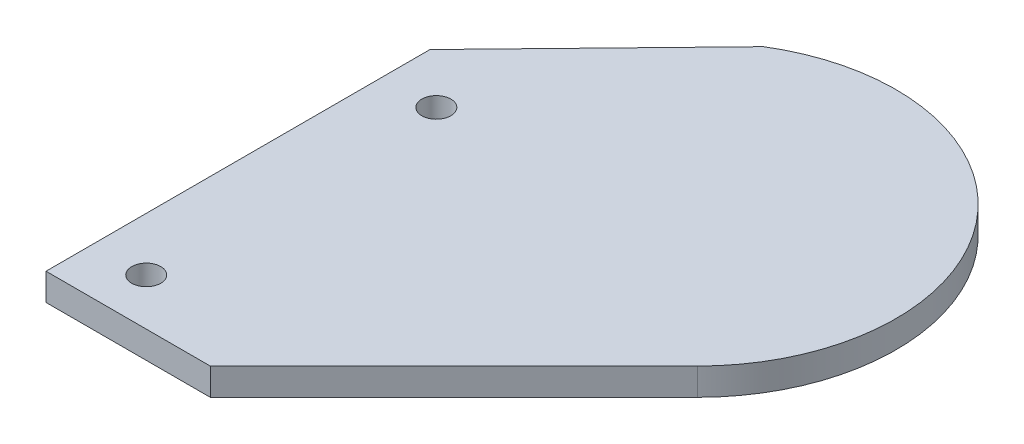
ISO-10303-21;
HEADER;
FILE_DESCRIPTION(('STEP AP214'),'2;1');
FILE_NAME('part.step','',(''),(''),'','','');
FILE_SCHEMA(('AUTOMOTIVE_DESIGN { 1 0 10303 214 1 1 1 1 }'));
ENDSEC;
DATA;
#1=APPLICATION_CONTEXT('core data for automotive mechanical design processes');
#2=APPLICATION_PROTOCOL_DEFINITION('international standard','automotive_design',2000,#1);
#3=PRODUCT_CONTEXT('',#1,'mechanical');
#4=PRODUCT('Part','Part','',(#3));
#5=PRODUCT_RELATED_PRODUCT_CATEGORY('part','',(#4));
#6=PRODUCT_DEFINITION_FORMATION('','',#4);
#7=PRODUCT_DEFINITION_CONTEXT('part definition',#1,'design');
#8=PRODUCT_DEFINITION('design','',#6,#7);
#9=PRODUCT_DEFINITION_SHAPE('','',#8);
#10=(LENGTH_UNIT() NAMED_UNIT(*) SI_UNIT(.MILLI.,.METRE.));
#11=(NAMED_UNIT(*) PLANE_ANGLE_UNIT() SI_UNIT($,.RADIAN.));
#12=(NAMED_UNIT(*) SI_UNIT($,.STERADIAN.) SOLID_ANGLE_UNIT());
#13=UNCERTAINTY_MEASURE_WITH_UNIT(LENGTH_MEASURE(1.E-05),#10,'distance_accuracy_value','');
#14=(GEOMETRIC_REPRESENTATION_CONTEXT(3) GLOBAL_UNCERTAINTY_ASSIGNED_CONTEXT((#13)) GLOBAL_UNIT_ASSIGNED_CONTEXT((#10,
#11,#12)) REPRESENTATION_CONTEXT('',''));
#15=CARTESIAN_POINT('',(0.,0.,0.));
#16=DIRECTION('',(0.,0.,1.));
#17=DIRECTION('',(1.,0.,0.));
#18=AXIS2_PLACEMENT_3D('',#15,#16,#17);
#19=CARTESIAN_POINT('',(0.,-6.35,0.));
#20=DIRECTION('',(-1.,0.,0.));
#21=DIRECTION('',(0.,0.,1.));
#22=AXIS2_PLACEMENT_3D('',#19,#20,#21);
#23=PLANE('',#22);
#24=DIRECTION('',(0.,0.,1.));
#25=VECTOR('',#24,1.);
#26=CARTESIAN_POINT('',(0.,0.,0.));
#27=LINE('',#26,#25);
#28=CARTESIAN_POINT('',(0.,0.,-90.));
#29=VERTEX_POINT('',#28);
#30=CARTESIAN_POINT('',(0.,0.,0.));
#31=VERTEX_POINT('',#30);
#32=EDGE_CURVE('E118',#29,#31,#27,.T.);
#33=ORIENTED_EDGE('',*,*,#32,.F.);
#34=DIRECTION('',(0.,1.,0.));
#35=VECTOR('',#34,1.);
#36=CARTESIAN_POINT('',(0.,-6.35,-90.));
#37=LINE('',#36,#35);
#38=CARTESIAN_POINT('',(0.,-6.35,-90.));
#39=VERTEX_POINT('',#38);
#40=EDGE_CURVE('E11',#39,#29,#37,.T.);
#41=ORIENTED_EDGE('',*,*,#40,.F.);
#42=DIRECTION('',(0.,0.,1.));
#43=VECTOR('',#42,1.);
#44=CARTESIAN_POINT('',(0.,-6.35,0.));
#45=LINE('',#44,#43);
#46=CARTESIAN_POINT('',(0.,-6.35,0.));
#47=VERTEX_POINT('',#46);
#48=EDGE_CURVE('E113',#39,#47,#45,.T.);
#49=ORIENTED_EDGE('',*,*,#48,.T.);
#50=DIRECTION('',(0.,1.,0.));
#51=VECTOR('',#50,1.);
#52=CARTESIAN_POINT('',(0.,-6.35,0.));
#53=LINE('',#52,#51);
#54=EDGE_CURVE('E44',#47,#31,#53,.T.);
#55=ORIENTED_EDGE('',*,*,#54,.T.);
#56=EDGE_LOOP('',(#33,#41,#49,#55));
#57=FACE_BOUND('',#56,.T.);
#58=ADVANCED_FACE('F41',(#57),#23,.T.);
#59=CARTESIAN_POINT('',(0.,-6.35,-90.));
#60=DIRECTION('',(-0.717622638837594,0.,-0.69643215622756));
#61=DIRECTION('',(-0.69643215622756,0.,0.717622638837594));
#62=AXIS2_PLACEMENT_3D('',#59,#60,#61);
#63=PLANE('',#62);
#64=DIRECTION('',(-0.69643215622756,0.,0.717622638837594));
#65=VECTOR('',#64,1.);
#66=CARTESIAN_POINT('',(0.,0.,-90.));
#67=LINE('',#66,#65);
#68=CARTESIAN_POINT('',(38.5109306503488,0.,-129.682710555893));
#69=VERTEX_POINT('',#68);
#70=EDGE_CURVE('E128',#69,#29,#67,.T.);
#71=ORIENTED_EDGE('',*,*,#70,.F.);
#72=DIRECTION('',(0.,1.,0.));
#73=VECTOR('',#72,1.);
#74=CARTESIAN_POINT('',(38.5109306503488,-6.35,-129.682710555893));
#75=LINE('',#74,#73);
#76=CARTESIAN_POINT('',(38.5109306503488,-6.35,-129.682710555893));
#77=VERTEX_POINT('',#76);
#78=EDGE_CURVE('E50',#77,#69,#75,.T.);
#79=ORIENTED_EDGE('',*,*,#78,.F.);
#80=DIRECTION('',(-0.69643215622756,0.,0.717622638837594));
#81=VECTOR('',#80,1.);
#82=CARTESIAN_POINT('',(0.,-6.35,-90.));
#83=LINE('',#82,#81);
#84=EDGE_CURVE('E108',#77,#39,#83,.T.);
#85=ORIENTED_EDGE('',*,*,#84,.T.);
#86=ORIENTED_EDGE('',*,*,#40,.T.);
#87=EDGE_LOOP('',(#71,#79,#85,#86));
#88=FACE_BOUND('',#87,.T.);
#89=ADVANCED_FACE('F134',(#88),#63,.T.);
#90=CARTESIAN_POINT('',(62.75,-6.35,-90.));
#91=DIRECTION('',(0.,1.,0.));
#92=DIRECTION('',(0.,0.,1.));
#93=AXIS2_PLACEMENT_3D('',#90,#91,#92);
#94=CYLINDRICAL_SURFACE('',#93,46.5);
#95=CARTESIAN_POINT('',(62.75,0.,-90.));
#96=DIRECTION('',(0.,1.,0.));
#97=DIRECTION('',(0.,0.,-1.));
#98=AXIS2_PLACEMENT_3D('',#95,#96,#97);
#99=CIRCLE('',#98,46.5);
#100=CARTESIAN_POINT('',(95.6304653251744,0.,-57.1195346748255));
#101=VERTEX_POINT('',#100);
#102=EDGE_CURVE('E97',#101,#69,#99,.T.);
#103=ORIENTED_EDGE('',*,*,#102,.F.);
#104=DIRECTION('',(0.,1.,0.));
#105=VECTOR('',#104,1.);
#106=CARTESIAN_POINT('',(95.6304653251744,-6.35,-57.1195346748255));
#107=LINE('',#106,#105);
#108=CARTESIAN_POINT('',(95.6304653251744,-6.35,-57.1195346748255));
#109=VERTEX_POINT('',#108);
#110=EDGE_CURVE('E92',#109,#101,#107,.T.);
#111=ORIENTED_EDGE('',*,*,#110,.F.);
#112=CARTESIAN_POINT('',(62.75,-6.35,-90.));
#113=DIRECTION('',(0.,1.,0.));
#114=DIRECTION('',(0.,0.,-1.));
#115=AXIS2_PLACEMENT_3D('',#112,#113,#114);
#116=CIRCLE('',#115,46.5);
#117=EDGE_CURVE('E95',#109,#77,#116,.T.);
#118=ORIENTED_EDGE('',*,*,#117,.T.);
#119=ORIENTED_EDGE('',*,*,#78,.T.);
#120=EDGE_LOOP('',(#103,#111,#118,#119));
#121=FACE_BOUND('',#120,.T.);
#122=ADVANCED_FACE('F94',(#121),#94,.T.);
#123=CARTESIAN_POINT('',(95.6304653251744,-6.35,-57.1195346748255));
#124=DIRECTION('',(0.707106781186547,0.,0.707106781186548));
#125=DIRECTION('',(0.707106781186548,0.,-0.707106781186547));
#126=AXIS2_PLACEMENT_3D('',#123,#124,#125);
#127=PLANE('',#126);
#128=DIRECTION('',(0.707106781186548,0.,-0.707106781186547));
#129=VECTOR('',#128,1.);
#130=CARTESIAN_POINT('',(95.6304653251744,0.,-57.1195346748255));
#131=LINE('',#130,#129);
#132=CARTESIAN_POINT('',(38.5109306503488,0.,0.));
#133=VERTEX_POINT('',#132);
#134=EDGE_CURVE('E125',#133,#101,#131,.T.);
#135=ORIENTED_EDGE('',*,*,#134,.F.);
#136=DIRECTION('',(0.,1.,0.));
#137=VECTOR('',#136,1.);
#138=CARTESIAN_POINT('',(38.5109306503488,-6.35,0.));
#139=LINE('',#138,#137);
#140=CARTESIAN_POINT('',(38.5109306503488,-6.35,0.));
#141=VERTEX_POINT('',#140);
#142=EDGE_CURVE('E102',#141,#133,#139,.T.);
#143=ORIENTED_EDGE('',*,*,#142,.F.);
#144=DIRECTION('',(0.707106781186548,0.,-0.707106781186547));
#145=VECTOR('',#144,1.);
#146=CARTESIAN_POINT('',(95.6304653251744,-6.35,-57.1195346748255));
#147=LINE('',#146,#145);
#148=EDGE_CURVE('E107',#141,#109,#147,.T.);
#149=ORIENTED_EDGE('',*,*,#148,.T.);
#150=ORIENTED_EDGE('',*,*,#110,.T.);
#151=EDGE_LOOP('',(#135,#143,#149,#150));
#152=FACE_BOUND('',#151,.T.);
#153=ADVANCED_FACE('F110',(#152),#127,.T.);
#154=CARTESIAN_POINT('',(0.,-6.35,0.));
#155=DIRECTION('',(0.,0.,1.));
#156=DIRECTION('',(1.,0.,0.));
#157=AXIS2_PLACEMENT_3D('',#154,#155,#156);
#158=PLANE('',#157);
#159=DIRECTION('',(1.,0.,0.));
#160=VECTOR('',#159,1.);
#161=CARTESIAN_POINT('',(0.,0.,0.));
#162=LINE('',#161,#160);
#163=EDGE_CURVE('E121',#31,#133,#162,.T.);
#164=ORIENTED_EDGE('',*,*,#163,.F.);
#165=ORIENTED_EDGE('',*,*,#54,.F.);
#166=DIRECTION('',(1.,0.,0.));
#167=VECTOR('',#166,1.);
#168=CARTESIAN_POINT('',(0.,-6.35,0.));
#169=LINE('',#168,#167);
#170=EDGE_CURVE('E111',#47,#141,#169,.T.);
#171=ORIENTED_EDGE('',*,*,#170,.T.);
#172=ORIENTED_EDGE('',*,*,#142,.T.);
#173=EDGE_LOOP('',(#164,#165,#171,#172));
#174=FACE_BOUND('',#173,.T.);
#175=ADVANCED_FACE('F131',(#174),#158,.T.);
#176=CARTESIAN_POINT('',(62.75,-6.35,-90.));
#177=DIRECTION('',(0.,-1.,0.));
#178=DIRECTION('',(0.,0.,-1.));
#179=AXIS2_PLACEMENT_3D('',#176,#177,#178);
#180=PLANE('',#179);
#181=CARTESIAN_POINT('',(12.5,-6.35,-79.));
#182=DIRECTION('',(0.,1.,0.));
#183=DIRECTION('',(0.,0.,1.));
#184=AXIS2_PLACEMENT_3D('',#181,#182,#183);
#185=CIRCLE('',#184,3.4);
#186=CARTESIAN_POINT('',(12.5,-6.35,-75.6));
#187=VERTEX_POINT('',#186);
#188=EDGE_CURVE('E122',#187,#187,#185,.T.);
#189=ORIENTED_EDGE('',*,*,#188,.T.);
#190=EDGE_LOOP('',(#189));
#191=FACE_BOUND('',#190,.T.);
#192=CARTESIAN_POINT('',(12.5,-6.35,-11.));
#193=DIRECTION('',(0.,1.,0.));
#194=DIRECTION('',(0.,0.,-1.));
#195=AXIS2_PLACEMENT_3D('',#192,#193,#194);
#196=CIRCLE('',#195,3.4);
#197=CARTESIAN_POINT('',(12.5,-6.35,-14.4));
#198=VERTEX_POINT('',#197);
#199=EDGE_CURVE('E176',#198,#198,#196,.T.);
#200=ORIENTED_EDGE('',*,*,#199,.T.);
#201=EDGE_LOOP('',(#200));
#202=FACE_BOUND('',#201,.T.);
#203=ORIENTED_EDGE('',*,*,#48,.F.);
#204=ORIENTED_EDGE('',*,*,#84,.F.);
#205=ORIENTED_EDGE('',*,*,#117,.F.);
#206=ORIENTED_EDGE('',*,*,#148,.F.);
#207=ORIENTED_EDGE('',*,*,#170,.F.);
#208=EDGE_LOOP('',(#203,#204,#205,#206,#207));
#209=FACE_BOUND('',#208,.T.);
#210=ADVANCED_FACE('F106',(#191,#202,#209),#180,.T.);
#211=CARTESIAN_POINT('',(62.75,0.,-90.));
#212=DIRECTION('',(0.,-1.,0.));
#213=DIRECTION('',(0.,0.,-1.));
#214=AXIS2_PLACEMENT_3D('',#211,#212,#213);
#215=PLANE('',#214);
#216=CARTESIAN_POINT('',(12.5,0.,-79.));
#217=DIRECTION('',(0.,1.,0.));
#218=DIRECTION('',(0.,0.,1.));
#219=AXIS2_PLACEMENT_3D('',#216,#217,#218);
#220=CIRCLE('',#219,3.4);
#221=CARTESIAN_POINT('',(12.5,0.,-75.6));
#222=VERTEX_POINT('',#221);
#223=EDGE_CURVE('E171',#222,#222,#220,.T.);
#224=ORIENTED_EDGE('',*,*,#223,.F.);
#225=EDGE_LOOP('',(#224));
#226=FACE_BOUND('',#225,.T.);
#227=CARTESIAN_POINT('',(12.5,0.,-11.));
#228=DIRECTION('',(0.,1.,0.));
#229=DIRECTION('',(0.,0.,-1.));
#230=AXIS2_PLACEMENT_3D('',#227,#228,#229);
#231=CIRCLE('',#230,3.4);
#232=CARTESIAN_POINT('',(12.5,0.,-14.4));
#233=VERTEX_POINT('',#232);
#234=EDGE_CURVE('E172',#233,#233,#231,.T.);
#235=ORIENTED_EDGE('',*,*,#234,.F.);
#236=EDGE_LOOP('',(#235));
#237=FACE_BOUND('',#236,.T.);
#238=ORIENTED_EDGE('',*,*,#32,.T.);
#239=ORIENTED_EDGE('',*,*,#163,.T.);
#240=ORIENTED_EDGE('',*,*,#134,.T.);
#241=ORIENTED_EDGE('',*,*,#102,.T.);
#242=ORIENTED_EDGE('',*,*,#70,.T.);
#243=EDGE_LOOP('',(#238,#239,#240,#241,#242));
#244=FACE_BOUND('',#243,.T.);
#245=ADVANCED_FACE('F133',(#226,#237,#244),#215,.F.);
#246=CARTESIAN_POINT('',(12.5,-6.35,-11.));
#247=DIRECTION('',(0.,1.,0.));
#248=DIRECTION('',(0.,0.,1.));
#249=AXIS2_PLACEMENT_3D('',#246,#247,#248);
#250=CYLINDRICAL_SURFACE('',#249,3.4);
#251=ORIENTED_EDGE('',*,*,#199,.F.);
#252=EDGE_LOOP('',(#251));
#253=FACE_BOUND('',#252,.T.);
#254=ORIENTED_EDGE('',*,*,#234,.T.);
#255=EDGE_LOOP('',(#254));
#256=FACE_BOUND('',#255,.T.);
#257=ADVANCED_FACE('F154',(#253,#256),#250,.F.);
#258=CARTESIAN_POINT('',(12.5,-6.35,-79.));
#259=DIRECTION('',(0.,1.,0.));
#260=DIRECTION('',(0.,0.,1.));
#261=AXIS2_PLACEMENT_3D('',#258,#259,#260);
#262=CYLINDRICAL_SURFACE('',#261,3.4);
#263=ORIENTED_EDGE('',*,*,#188,.F.);
#264=EDGE_LOOP('',(#263));
#265=FACE_BOUND('',#264,.T.);
#266=ORIENTED_EDGE('',*,*,#223,.T.);
#267=EDGE_LOOP('',(#266));
#268=FACE_BOUND('',#267,.T.);
#269=ADVANCED_FACE('F161',(#265,#268),#262,.F.);
#270=CLOSED_SHELL('',(#58,#89,#122,#153,#175,#210,#245,#257,#269));
#271=MANIFOLD_SOLID_BREP('B2',#270);
#272=ADVANCED_BREP_SHAPE_REPRESENTATION('',(#18,#271),#14);
#273=SHAPE_DEFINITION_REPRESENTATION(#9,#272);
ENDSEC;
END-ISO-10303-21;
